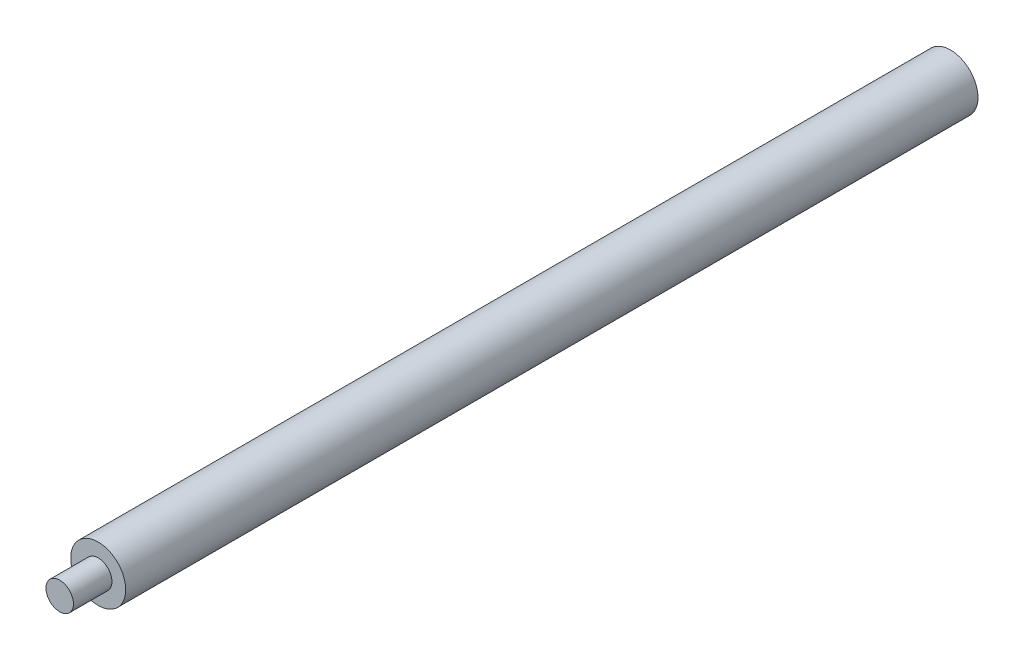
ISO-10303-21;
HEADER;
FILE_DESCRIPTION(('STEP AP214'),'2;1');
FILE_NAME('part.step','',(''),(''),'','','');
FILE_SCHEMA(('AUTOMOTIVE_DESIGN { 1 0 10303 214 1 1 1 1 }'));
ENDSEC;
DATA;
#1=APPLICATION_CONTEXT('core data for automotive mechanical design processes');
#2=APPLICATION_PROTOCOL_DEFINITION('international standard','automotive_design',2000,#1);
#3=PRODUCT_CONTEXT('',#1,'mechanical');
#4=PRODUCT('Part','Part','',(#3));
#5=PRODUCT_RELATED_PRODUCT_CATEGORY('part','',(#4));
#6=PRODUCT_DEFINITION_FORMATION('','',#4);
#7=PRODUCT_DEFINITION_CONTEXT('part definition',#1,'design');
#8=PRODUCT_DEFINITION('design','',#6,#7);
#9=PRODUCT_DEFINITION_SHAPE('','',#8);
#10=(LENGTH_UNIT() NAMED_UNIT(*) SI_UNIT(.MILLI.,.METRE.));
#11=(NAMED_UNIT(*) PLANE_ANGLE_UNIT() SI_UNIT($,.RADIAN.));
#12=(NAMED_UNIT(*) SI_UNIT($,.STERADIAN.) SOLID_ANGLE_UNIT());
#13=UNCERTAINTY_MEASURE_WITH_UNIT(LENGTH_MEASURE(1.E-05),#10,'distance_accuracy_value','');
#14=(GEOMETRIC_REPRESENTATION_CONTEXT(3) GLOBAL_UNCERTAINTY_ASSIGNED_CONTEXT((#13)) GLOBAL_UNIT_ASSIGNED_CONTEXT((#10,
#11,#12)) REPRESENTATION_CONTEXT('',''));
#15=CARTESIAN_POINT('',(0.,0.,0.));
#16=DIRECTION('',(0.,0.,1.));
#17=DIRECTION('',(1.,0.,0.));
#18=AXIS2_PLACEMENT_3D('',#15,#16,#17);
#19=CARTESIAN_POINT('',(0.,0.,155.));
#20=DIRECTION('',(0.,0.,-1.));
#21=DIRECTION('',(-1.,0.,0.));
#22=AXIS2_PLACEMENT_3D('',#19,#20,#21);
#23=CYLINDRICAL_SURFACE('',#22,5.);
#24=CARTESIAN_POINT('',(0.,0.,155.));
#25=DIRECTION('',(0.,0.,1.));
#26=DIRECTION('',(1.,0.,0.));
#27=AXIS2_PLACEMENT_3D('',#24,#25,#26);
#28=CIRCLE('',#27,5.);
#29=CARTESIAN_POINT('',(5.,0.,155.));
#30=VERTEX_POINT('',#29);
#31=EDGE_CURVE('E44',#30,#30,#28,.T.);
#32=ORIENTED_EDGE('',*,*,#31,.F.);
#33=EDGE_LOOP('',(#32));
#34=FACE_BOUND('',#33,.T.);
#35=CARTESIAN_POINT('',(0.,0.,0.));
#36=DIRECTION('',(0.,0.,1.));
#37=DIRECTION('',(1.,0.,0.));
#38=AXIS2_PLACEMENT_3D('',#35,#36,#37);
#39=CIRCLE('',#38,5.);
#40=CARTESIAN_POINT('',(5.,0.,0.));
#41=VERTEX_POINT('',#40);
#42=EDGE_CURVE('E40',#41,#41,#39,.T.);
#43=ORIENTED_EDGE('',*,*,#42,.T.);
#44=EDGE_LOOP('',(#43));
#45=FACE_BOUND('',#44,.T.);
#46=ADVANCED_FACE('F37',(#34,#45),#23,.T.);
#47=CARTESIAN_POINT('',(0.,0.,155.));
#48=DIRECTION('',(0.,0.,1.));
#49=DIRECTION('',(1.,0.,0.));
#50=AXIS2_PLACEMENT_3D('',#47,#48,#49);
#51=PLANE('',#50);
#52=CARTESIAN_POINT('',(0.,0.,155.));
#53=DIRECTION('',(0.,0.,1.));
#54=DIRECTION('',(1.,0.,0.));
#55=AXIS2_PLACEMENT_3D('',#52,#53,#54);
#56=CIRCLE('',#55,2.5);
#57=CARTESIAN_POINT('',(2.5,0.,155.));
#58=VERTEX_POINT('',#57);
#59=EDGE_CURVE('E10',#58,#58,#56,.T.);
#60=ORIENTED_EDGE('',*,*,#59,.F.);
#61=EDGE_LOOP('',(#60));
#62=FACE_BOUND('',#61,.T.);
#63=ORIENTED_EDGE('',*,*,#31,.T.);
#64=EDGE_LOOP('',(#63));
#65=FACE_BOUND('',#64,.T.);
#66=ADVANCED_FACE('F73',(#62,#65),#51,.T.);
#67=CARTESIAN_POINT('',(0.,0.,0.));
#68=DIRECTION('',(0.,0.,1.));
#69=DIRECTION('',(1.,0.,0.));
#70=AXIS2_PLACEMENT_3D('',#67,#68,#69);
#71=PLANE('',#70);
#72=CARTESIAN_POINT('',(0.,0.,0.));
#73=DIRECTION('',(0.,0.,-1.));
#74=DIRECTION('',(-1.,0.,0.));
#75=AXIS2_PLACEMENT_3D('',#72,#73,#74);
#76=CIRCLE('',#75,3.);
#77=CARTESIAN_POINT('',(-3.,0.,0.));
#78=VERTEX_POINT('',#77);
#79=EDGE_CURVE('E54',#78,#78,#76,.T.);
#80=ORIENTED_EDGE('',*,*,#79,.F.);
#81=EDGE_LOOP('',(#80));
#82=FACE_BOUND('',#81,.T.);
#83=ORIENTED_EDGE('',*,*,#42,.F.);
#84=EDGE_LOOP('',(#83));
#85=FACE_BOUND('',#84,.T.);
#86=ADVANCED_FACE('F69',(#82,#85),#71,.F.);
#87=CARTESIAN_POINT('',(0.,0.,162.));
#88=DIRECTION('',(0.,0.,-1.));
#89=DIRECTION('',(-1.,0.,0.));
#90=AXIS2_PLACEMENT_3D('',#87,#88,#89);
#91=CYLINDRICAL_SURFACE('',#90,2.5);
#92=CARTESIAN_POINT('',(0.,0.,162.));
#93=DIRECTION('',(0.,0.,1.));
#94=DIRECTION('',(1.,0.,0.));
#95=AXIS2_PLACEMENT_3D('',#92,#93,#94);
#96=CIRCLE('',#95,2.5);
#97=CARTESIAN_POINT('',(2.5,0.,162.));
#98=VERTEX_POINT('',#97);
#99=EDGE_CURVE('E50',#98,#98,#96,.T.);
#100=ORIENTED_EDGE('',*,*,#99,.F.);
#101=EDGE_LOOP('',(#100));
#102=FACE_BOUND('',#101,.T.);
#103=ORIENTED_EDGE('',*,*,#59,.T.);
#104=EDGE_LOOP('',(#103));
#105=FACE_BOUND('',#104,.T.);
#106=ADVANCED_FACE('F72',(#102,#105),#91,.T.);
#107=CARTESIAN_POINT('',(0.,0.,162.));
#108=DIRECTION('',(0.,0.,1.));
#109=DIRECTION('',(1.,0.,0.));
#110=AXIS2_PLACEMENT_3D('',#107,#108,#109);
#111=PLANE('',#110);
#112=ORIENTED_EDGE('',*,*,#99,.T.);
#113=EDGE_LOOP('',(#112));
#114=FACE_BOUND('',#113,.T.);
#115=ADVANCED_FACE('F65',(#114),#111,.T.);
#116=CARTESIAN_POINT('',(0.,0.,10.));
#117=DIRECTION('',(0.,0.,-1.));
#118=DIRECTION('',(-1.,0.,0.));
#119=AXIS2_PLACEMENT_3D('',#116,#117,#118);
#120=CYLINDRICAL_SURFACE('',#119,3.);
#121=CARTESIAN_POINT('',(0.,0.,10.));
#122=DIRECTION('',(0.,0.,-1.));
#123=DIRECTION('',(-1.,0.,0.));
#124=AXIS2_PLACEMENT_3D('',#121,#122,#123);
#125=CIRCLE('',#124,3.);
#126=CARTESIAN_POINT('',(-3.,0.,10.));
#127=VERTEX_POINT('',#126);
#128=EDGE_CURVE('E53',#127,#127,#125,.T.);
#129=ORIENTED_EDGE('',*,*,#128,.F.);
#130=EDGE_LOOP('',(#129));
#131=FACE_BOUND('',#130,.T.);
#132=ORIENTED_EDGE('',*,*,#79,.T.);
#133=EDGE_LOOP('',(#132));
#134=FACE_BOUND('',#133,.T.);
#135=ADVANCED_FACE('F62',(#131,#134),#120,.F.);
#136=CARTESIAN_POINT('',(0.,0.,10.));
#137=DIRECTION('',(0.,0.,-1.));
#138=DIRECTION('',(-1.,0.,0.));
#139=AXIS2_PLACEMENT_3D('',#136,#137,#138);
#140=PLANE('',#139);
#141=ORIENTED_EDGE('',*,*,#128,.T.);
#142=EDGE_LOOP('',(#141));
#143=FACE_BOUND('',#142,.T.);
#144=ADVANCED_FACE('F60',(#143),#140,.T.);
#145=CLOSED_SHELL('',(#46,#66,#86,#106,#115,#135,#144));
#146=MANIFOLD_SOLID_BREP('B2',#145);
#147=ADVANCED_BREP_SHAPE_REPRESENTATION('',(#18,#146),#14);
#148=SHAPE_DEFINITION_REPRESENTATION(#9,#147);
ENDSEC;
END-ISO-10303-21;
